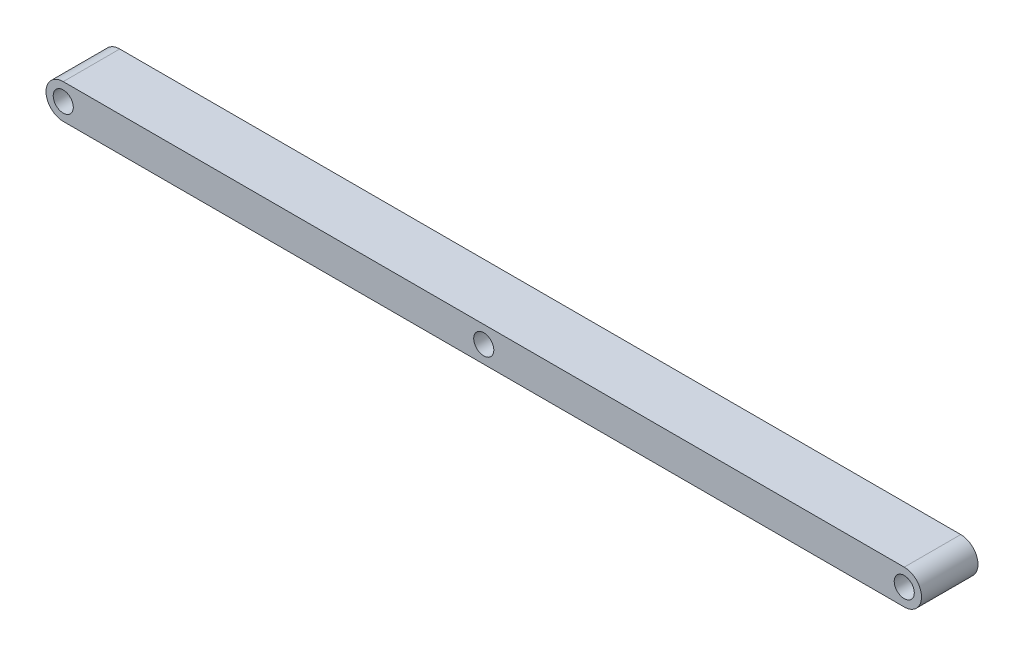
ISO-10303-21;
HEADER;
FILE_DESCRIPTION(('STEP AP214'),'2;1');
FILE_NAME('part.step','',(''),(''),'','','');
FILE_SCHEMA(('AUTOMOTIVE_DESIGN { 1 0 10303 214 1 1 1 1 }'));
ENDSEC;
DATA;
#1=APPLICATION_CONTEXT('core data for automotive mechanical design processes');
#2=APPLICATION_PROTOCOL_DEFINITION('international standard','automotive_design',2000,#1);
#3=PRODUCT_CONTEXT('',#1,'mechanical');
#4=PRODUCT('Part','Part','',(#3));
#5=PRODUCT_RELATED_PRODUCT_CATEGORY('part','',(#4));
#6=PRODUCT_DEFINITION_FORMATION('','',#4);
#7=PRODUCT_DEFINITION_CONTEXT('part definition',#1,'design');
#8=PRODUCT_DEFINITION('design','',#6,#7);
#9=PRODUCT_DEFINITION_SHAPE('','',#8);
#10=(LENGTH_UNIT() NAMED_UNIT(*) SI_UNIT(.MILLI.,.METRE.));
#11=(NAMED_UNIT(*) PLANE_ANGLE_UNIT() SI_UNIT($,.RADIAN.));
#12=(NAMED_UNIT(*) SI_UNIT($,.STERADIAN.) SOLID_ANGLE_UNIT());
#13=UNCERTAINTY_MEASURE_WITH_UNIT(LENGTH_MEASURE(1.E-05),#10,'distance_accuracy_value','');
#14=(GEOMETRIC_REPRESENTATION_CONTEXT(3) GLOBAL_UNCERTAINTY_ASSIGNED_CONTEXT((#13)) GLOBAL_UNIT_ASSIGNED_CONTEXT((#10,
#11,#12)) REPRESENTATION_CONTEXT('',''));
#15=CARTESIAN_POINT('',(0.,0.,0.));
#16=DIRECTION('',(0.,0.,1.));
#17=DIRECTION('',(1.,0.,0.));
#18=AXIS2_PLACEMENT_3D('',#15,#16,#17);
#19=CARTESIAN_POINT('',(-41.9263803680981,0.,9.));
#20=DIRECTION('',(0.,0.,1.));
#21=DIRECTION('',(1.,0.,0.));
#22=AXIS2_PLACEMENT_3D('',#19,#20,#21);
#23=PLANE('',#22);
#24=CARTESIAN_POINT('',(-41.9263803680981,0.,9.));
#25=DIRECTION('',(0.,0.,1.));
#26=DIRECTION('',(1.,0.,0.));
#27=AXIS2_PLACEMENT_3D('',#24,#25,#26);
#28=CIRCLE('',#27,1.6);
#29=CARTESIAN_POINT('',(-40.3263803680981,0.,9.));
#30=VERTEX_POINT('',#29);
#31=EDGE_CURVE('E134',#30,#30,#28,.T.);
#32=ORIENTED_EDGE('',*,*,#31,.F.);
#33=EDGE_LOOP('',(#32));
#34=FACE_BOUND('',#33,.T.);
#35=CARTESIAN_POINT('',(-41.9263803680981,0.,9.));
#36=DIRECTION('',(0.,0.,1.));
#37=DIRECTION('',(1.,0.,0.));
#38=AXIS2_PLACEMENT_3D('',#35,#36,#37);
#39=CIRCLE('',#38,2.75);
#40=CARTESIAN_POINT('',(-41.9263803680981,2.75,9.));
#41=VERTEX_POINT('',#40);
#42=CARTESIAN_POINT('',(-41.9263803680981,-2.75,9.));
#43=VERTEX_POINT('',#42);
#44=EDGE_CURVE('E92',#41,#43,#39,.T.);
#45=ORIENTED_EDGE('',*,*,#44,.T.);
#46=DIRECTION('',(1.,0.,0.));
#47=VECTOR('',#46,1.);
#48=CARTESIAN_POINT('',(-41.9263803680981,-2.75,9.));
#49=LINE('',#48,#47);
#50=CARTESIAN_POINT('',(92.0736196319019,-2.75,9.));
#51=VERTEX_POINT('',#50);
#52=EDGE_CURVE('E87',#43,#51,#49,.T.);
#53=ORIENTED_EDGE('',*,*,#52,.T.);
#54=CARTESIAN_POINT('',(92.0736196319019,0.,9.));
#55=DIRECTION('',(0.,0.,1.));
#56=DIRECTION('',(1.,0.,0.));
#57=AXIS2_PLACEMENT_3D('',#54,#55,#56);
#58=CIRCLE('',#57,2.75);
#59=CARTESIAN_POINT('',(92.0736196319019,2.75,9.));
#60=VERTEX_POINT('',#59);
#61=EDGE_CURVE('E90',#51,#60,#58,.T.);
#62=ORIENTED_EDGE('',*,*,#61,.T.);
#63=DIRECTION('',(-1.,0.,0.));
#64=VECTOR('',#63,1.);
#65=CARTESIAN_POINT('',(-41.9263803680981,2.75,9.));
#66=LINE('',#65,#64);
#67=EDGE_CURVE('E57',#60,#41,#66,.T.);
#68=ORIENTED_EDGE('',*,*,#67,.T.);
#69=EDGE_LOOP('',(#45,#53,#62,#68));
#70=FACE_BOUND('',#69,.T.);
#71=CARTESIAN_POINT('',(92.0736196319019,0.,9.));
#72=DIRECTION('',(0.,0.,1.));
#73=DIRECTION('',(1.,0.,0.));
#74=AXIS2_PLACEMENT_3D('',#71,#72,#73);
#75=CIRCLE('',#74,1.60000000000001);
#76=CARTESIAN_POINT('',(93.6736196319019,0.,9.));
#77=VERTEX_POINT('',#76);
#78=EDGE_CURVE('E112',#77,#77,#75,.T.);
#79=ORIENTED_EDGE('',*,*,#78,.F.);
#80=EDGE_LOOP('',(#79));
#81=FACE_BOUND('',#80,.T.);
#82=CARTESIAN_POINT('',(25.0736196319019,0.,9.));
#83=DIRECTION('',(0.,0.,1.));
#84=DIRECTION('',(1.,0.,0.));
#85=AXIS2_PLACEMENT_3D('',#82,#83,#84);
#86=CIRCLE('',#85,1.6);
#87=CARTESIAN_POINT('',(26.6736196319019,0.,9.));
#88=VERTEX_POINT('',#87);
#89=EDGE_CURVE('E142',#88,#88,#86,.T.);
#90=ORIENTED_EDGE('',*,*,#89,.F.);
#91=EDGE_LOOP('',(#90));
#92=FACE_BOUND('',#91,.T.);
#93=ADVANCED_FACE('F39',(#34,#70,#81,#92),#23,.T.);
#94=CARTESIAN_POINT('',(-41.9263803680981,0.,0.));
#95=DIRECTION('',(0.,0.,1.));
#96=DIRECTION('',(1.,0.,0.));
#97=AXIS2_PLACEMENT_3D('',#94,#95,#96);
#98=PLANE('',#97);
#99=CARTESIAN_POINT('',(-41.9263803680981,0.,0.));
#100=DIRECTION('',(0.,0.,1.));
#101=DIRECTION('',(1.,0.,0.));
#102=AXIS2_PLACEMENT_3D('',#99,#100,#101);
#103=CIRCLE('',#102,2.75);
#104=CARTESIAN_POINT('',(-41.9263803680981,2.75,0.));
#105=VERTEX_POINT('',#104);
#106=CARTESIAN_POINT('',(-41.9263803680981,-2.75,0.));
#107=VERTEX_POINT('',#106);
#108=EDGE_CURVE('E108',#105,#107,#103,.T.);
#109=ORIENTED_EDGE('',*,*,#108,.F.);
#110=DIRECTION('',(-1.,0.,0.));
#111=VECTOR('',#110,1.);
#112=CARTESIAN_POINT('',(-41.9263803680981,2.75,0.));
#113=LINE('',#112,#111);
#114=CARTESIAN_POINT('',(92.0736196319019,2.75,0.));
#115=VERTEX_POINT('',#114);
#116=EDGE_CURVE('E80',#115,#105,#113,.T.);
#117=ORIENTED_EDGE('',*,*,#116,.F.);
#118=CARTESIAN_POINT('',(92.0736196319019,0.,0.));
#119=DIRECTION('',(0.,0.,1.));
#120=DIRECTION('',(1.,0.,0.));
#121=AXIS2_PLACEMENT_3D('',#118,#119,#120);
#122=CIRCLE('',#121,2.75);
#123=CARTESIAN_POINT('',(92.0736196319019,-2.75,0.));
#124=VERTEX_POINT('',#123);
#125=EDGE_CURVE('E74',#124,#115,#122,.T.);
#126=ORIENTED_EDGE('',*,*,#125,.F.);
#127=DIRECTION('',(1.,0.,0.));
#128=VECTOR('',#127,1.);
#129=CARTESIAN_POINT('',(-41.9263803680981,-2.75,0.));
#130=LINE('',#129,#128);
#131=EDGE_CURVE('E97',#107,#124,#130,.T.);
#132=ORIENTED_EDGE('',*,*,#131,.F.);
#133=EDGE_LOOP('',(#109,#117,#126,#132));
#134=FACE_BOUND('',#133,.T.);
#135=CARTESIAN_POINT('',(92.0736196319019,0.,0.));
#136=DIRECTION('',(0.,0.,1.));
#137=DIRECTION('',(1.,0.,0.));
#138=AXIS2_PLACEMENT_3D('',#135,#136,#137);
#139=CIRCLE('',#138,1.60000000000001);
#140=CARTESIAN_POINT('',(93.6736196319019,0.,0.));
#141=VERTEX_POINT('',#140);
#142=EDGE_CURVE('E130',#141,#141,#139,.T.);
#143=ORIENTED_EDGE('',*,*,#142,.T.);
#144=EDGE_LOOP('',(#143));
#145=FACE_BOUND('',#144,.T.);
#146=CARTESIAN_POINT('',(-41.9263803680981,0.,0.));
#147=DIRECTION('',(0.,0.,1.));
#148=DIRECTION('',(1.,0.,0.));
#149=AXIS2_PLACEMENT_3D('',#146,#147,#148);
#150=CIRCLE('',#149,1.6);
#151=CARTESIAN_POINT('',(-40.3263803680981,0.,0.));
#152=VERTEX_POINT('',#151);
#153=EDGE_CURVE('E138',#152,#152,#150,.T.);
#154=ORIENTED_EDGE('',*,*,#153,.T.);
#155=EDGE_LOOP('',(#154));
#156=FACE_BOUND('',#155,.T.);
#157=CARTESIAN_POINT('',(25.0736196319019,0.,0.));
#158=DIRECTION('',(0.,0.,1.));
#159=DIRECTION('',(1.,0.,0.));
#160=AXIS2_PLACEMENT_3D('',#157,#158,#159);
#161=CIRCLE('',#160,1.6);
#162=CARTESIAN_POINT('',(26.6736196319019,0.,0.));
#163=VERTEX_POINT('',#162);
#164=EDGE_CURVE('E146',#163,#163,#161,.T.);
#165=ORIENTED_EDGE('',*,*,#164,.T.);
#166=EDGE_LOOP('',(#165));
#167=FACE_BOUND('',#166,.T.);
#168=ADVANCED_FACE('F125',(#134,#145,#156,#167),#98,.F.);
#169=CARTESIAN_POINT('',(-41.9263803680981,0.,9.));
#170=DIRECTION('',(0.,0.,-1.));
#171=DIRECTION('',(-1.,0.,0.));
#172=AXIS2_PLACEMENT_3D('',#169,#170,#171);
#173=CYLINDRICAL_SURFACE('',#172,2.75);
#174=ORIENTED_EDGE('',*,*,#108,.T.);
#175=DIRECTION('',(0.,0.,-1.));
#176=VECTOR('',#175,1.);
#177=CARTESIAN_POINT('',(-41.9263803680981,-2.75,9.));
#178=LINE('',#177,#176);
#179=EDGE_CURVE('E11',#43,#107,#178,.T.);
#180=ORIENTED_EDGE('',*,*,#179,.F.);
#181=ORIENTED_EDGE('',*,*,#44,.F.);
#182=DIRECTION('',(0.,0.,-1.));
#183=VECTOR('',#182,1.);
#184=CARTESIAN_POINT('',(-41.9263803680981,2.75,9.));
#185=LINE('',#184,#183);
#186=EDGE_CURVE('E104',#41,#105,#185,.T.);
#187=ORIENTED_EDGE('',*,*,#186,.T.);
#188=EDGE_LOOP('',(#174,#180,#181,#187));
#189=FACE_BOUND('',#188,.T.);
#190=ADVANCED_FACE('F41',(#189),#173,.T.);
#191=CARTESIAN_POINT('',(-41.9263803680981,-2.75,9.));
#192=DIRECTION('',(0.,1.,0.));
#193=DIRECTION('',(0.,0.,1.));
#194=AXIS2_PLACEMENT_3D('',#191,#192,#193);
#195=PLANE('',#194);
#196=ORIENTED_EDGE('',*,*,#131,.T.);
#197=DIRECTION('',(0.,0.,-1.));
#198=VECTOR('',#197,1.);
#199=CARTESIAN_POINT('',(92.0736196319019,-2.75,9.));
#200=LINE('',#199,#198);
#201=EDGE_CURVE('E49',#51,#124,#200,.T.);
#202=ORIENTED_EDGE('',*,*,#201,.F.);
#203=ORIENTED_EDGE('',*,*,#52,.F.);
#204=ORIENTED_EDGE('',*,*,#179,.T.);
#205=EDGE_LOOP('',(#196,#202,#203,#204));
#206=FACE_BOUND('',#205,.T.);
#207=ADVANCED_FACE('F96',(#206),#195,.F.);
#208=CARTESIAN_POINT('',(92.0736196319019,0.,9.));
#209=DIRECTION('',(0.,0.,-1.));
#210=DIRECTION('',(-1.,0.,0.));
#211=AXIS2_PLACEMENT_3D('',#208,#209,#210);
#212=CYLINDRICAL_SURFACE('',#211,2.75);
#213=ORIENTED_EDGE('',*,*,#125,.T.);
#214=DIRECTION('',(0.,0.,-1.));
#215=VECTOR('',#214,1.);
#216=CARTESIAN_POINT('',(92.0736196319019,2.75,9.));
#217=LINE('',#216,#215);
#218=EDGE_CURVE('E99',#60,#115,#217,.T.);
#219=ORIENTED_EDGE('',*,*,#218,.F.);
#220=ORIENTED_EDGE('',*,*,#61,.F.);
#221=ORIENTED_EDGE('',*,*,#201,.T.);
#222=EDGE_LOOP('',(#213,#219,#220,#221));
#223=FACE_BOUND('',#222,.T.);
#224=ADVANCED_FACE('F100',(#223),#212,.T.);
#225=CARTESIAN_POINT('',(-41.9263803680981,2.75,9.));
#226=DIRECTION('',(0.,-1.,0.));
#227=DIRECTION('',(0.,0.,-1.));
#228=AXIS2_PLACEMENT_3D('',#225,#226,#227);
#229=PLANE('',#228);
#230=ORIENTED_EDGE('',*,*,#116,.T.);
#231=ORIENTED_EDGE('',*,*,#186,.F.);
#232=ORIENTED_EDGE('',*,*,#67,.F.);
#233=ORIENTED_EDGE('',*,*,#218,.T.);
#234=EDGE_LOOP('',(#230,#231,#232,#233));
#235=FACE_BOUND('',#234,.T.);
#236=ADVANCED_FACE('F122',(#235),#229,.F.);
#237=CARTESIAN_POINT('',(92.0736196319019,0.,9.));
#238=DIRECTION('',(0.,0.,-1.));
#239=DIRECTION('',(-1.,0.,0.));
#240=AXIS2_PLACEMENT_3D('',#237,#238,#239);
#241=CYLINDRICAL_SURFACE('',#240,1.60000000000001);
#242=ORIENTED_EDGE('',*,*,#78,.T.);
#243=EDGE_LOOP('',(#242));
#244=FACE_BOUND('',#243,.T.);
#245=ORIENTED_EDGE('',*,*,#142,.F.);
#246=EDGE_LOOP('',(#245));
#247=FACE_BOUND('',#246,.T.);
#248=ADVANCED_FACE('F166',(#244,#247),#241,.F.);
#249=CARTESIAN_POINT('',(-41.9263803680981,0.,9.));
#250=DIRECTION('',(0.,0.,-1.));
#251=DIRECTION('',(-1.,0.,0.));
#252=AXIS2_PLACEMENT_3D('',#249,#250,#251);
#253=CYLINDRICAL_SURFACE('',#252,1.6);
#254=ORIENTED_EDGE('',*,*,#31,.T.);
#255=EDGE_LOOP('',(#254));
#256=FACE_BOUND('',#255,.T.);
#257=ORIENTED_EDGE('',*,*,#153,.F.);
#258=EDGE_LOOP('',(#257));
#259=FACE_BOUND('',#258,.T.);
#260=ADVANCED_FACE('F212',(#256,#259),#253,.F.);
#261=CARTESIAN_POINT('',(25.0736196319019,0.,9.));
#262=DIRECTION('',(0.,0.,-1.));
#263=DIRECTION('',(-1.,0.,0.));
#264=AXIS2_PLACEMENT_3D('',#261,#262,#263);
#265=CYLINDRICAL_SURFACE('',#264,1.6);
#266=ORIENTED_EDGE('',*,*,#89,.T.);
#267=EDGE_LOOP('',(#266));
#268=FACE_BOUND('',#267,.T.);
#269=ORIENTED_EDGE('',*,*,#164,.F.);
#270=EDGE_LOOP('',(#269));
#271=FACE_BOUND('',#270,.T.);
#272=ADVANCED_FACE('F154',(#268,#271),#265,.F.);
#273=CLOSED_SHELL('',(#93,#168,#190,#207,#224,#236,#248,#260,#272));
#274=MANIFOLD_SOLID_BREP('B2',#273);
#275=ADVANCED_BREP_SHAPE_REPRESENTATION('',(#18,#274),#14);
#276=SHAPE_DEFINITION_REPRESENTATION(#9,#275);
ENDSEC;
END-ISO-10303-21;
